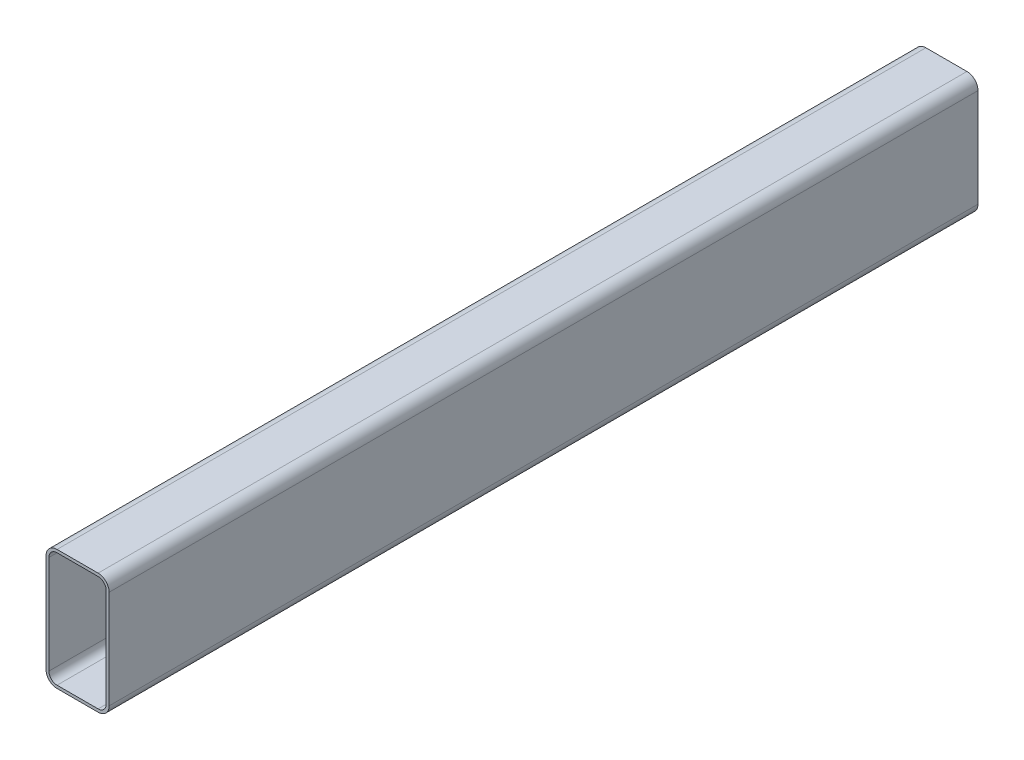
ISO-10303-21;
HEADER;
FILE_DESCRIPTION(('STEP AP214'),'2;1');
FILE_NAME('part.step','',(''),(''),'','','');
FILE_SCHEMA(('AUTOMOTIVE_DESIGN { 1 0 10303 214 1 1 1 1 }'));
ENDSEC;
DATA;
#1=APPLICATION_CONTEXT('core data for automotive mechanical design processes');
#2=APPLICATION_PROTOCOL_DEFINITION('international standard','automotive_design',2000,#1);
#3=PRODUCT_CONTEXT('',#1,'mechanical');
#4=PRODUCT('Part','Part','',(#3));
#5=PRODUCT_RELATED_PRODUCT_CATEGORY('part','',(#4));
#6=PRODUCT_DEFINITION_FORMATION('','',#4);
#7=PRODUCT_DEFINITION_CONTEXT('part definition',#1,'design');
#8=PRODUCT_DEFINITION('design','',#6,#7);
#9=PRODUCT_DEFINITION_SHAPE('','',#8);
#10=(LENGTH_UNIT() NAMED_UNIT(*) SI_UNIT(.MILLI.,.METRE.));
#11=(NAMED_UNIT(*) PLANE_ANGLE_UNIT() SI_UNIT($,.RADIAN.));
#12=(NAMED_UNIT(*) SI_UNIT($,.STERADIAN.) SOLID_ANGLE_UNIT());
#13=UNCERTAINTY_MEASURE_WITH_UNIT(LENGTH_MEASURE(1.E-05),#10,'distance_accuracy_value','');
#14=(GEOMETRIC_REPRESENTATION_CONTEXT(3) GLOBAL_UNCERTAINTY_ASSIGNED_CONTEXT((#13)) GLOBAL_UNIT_ASSIGNED_CONTEXT((#10,
#11,#12)) REPRESENTATION_CONTEXT('',''));
#15=CARTESIAN_POINT('',(0.,0.,0.));
#16=DIRECTION('',(0.,0.,1.));
#17=DIRECTION('',(1.,0.,0.));
#18=AXIS2_PLACEMENT_3D('',#15,#16,#17);
#19=CARTESIAN_POINT('',(9.001125,26.416,152.4));
#20=DIRECTION('',(0.,-1.,0.));
#21=DIRECTION('',(0.,0.,-1.));
#22=AXIS2_PLACEMENT_3D('',#19,#20,#21);
#23=PLANE('',#22);
#24=DIRECTION('',(0.,0.,-1.));
#25=VECTOR('',#24,1.);
#26=CARTESIAN_POINT('',(-9.001125,26.416,152.4));
#27=LINE('',#26,#25);
#28=CARTESIAN_POINT('',(-9.001125,26.416,152.4));
#29=VERTEX_POINT('',#28);
#30=CARTESIAN_POINT('',(-9.001125,26.416,-228.6));
#31=VERTEX_POINT('',#30);
#32=EDGE_CURVE('E167',#29,#31,#27,.T.);
#33=ORIENTED_EDGE('',*,*,#32,.F.);
#34=DIRECTION('',(1.,0.,0.));
#35=VECTOR('',#34,1.);
#36=CARTESIAN_POINT('',(9.001125,26.416,152.4));
#37=LINE('',#36,#35);
#38=CARTESIAN_POINT('',(9.001125,26.416,152.4));
#39=VERTEX_POINT('',#38);
#40=EDGE_CURVE('E244',#39,#29,#37,.F.);
#41=ORIENTED_EDGE('',*,*,#40,.F.);
#42=DIRECTION('',(0.,0.,-1.));
#43=VECTOR('',#42,1.);
#44=CARTESIAN_POINT('',(9.001125,26.416,152.4));
#45=LINE('',#44,#43);
#46=CARTESIAN_POINT('',(9.001125,26.416,-228.6));
#47=VERTEX_POINT('',#46);
#48=EDGE_CURVE('E261',#47,#39,#45,.F.);
#49=ORIENTED_EDGE('',*,*,#48,.F.);
#50=DIRECTION('',(1.,0.,0.));
#51=VECTOR('',#50,1.);
#52=CARTESIAN_POINT('',(-9.001125,26.416,-228.6));
#53=LINE('',#52,#51);
#54=EDGE_CURVE('E218',#31,#47,#53,.T.);
#55=ORIENTED_EDGE('',*,*,#54,.F.);
#56=EDGE_LOOP('',(#33,#41,#49,#55));
#57=FACE_BOUND('',#56,.T.);
#58=ADVANCED_FACE('F37',(#57),#23,.F.);
#59=CARTESIAN_POINT('',(-9.001125,-26.416,152.4));
#60=DIRECTION('',(0.,1.,0.));
#61=DIRECTION('',(0.,0.,1.));
#62=AXIS2_PLACEMENT_3D('',#59,#60,#61);
#63=PLANE('',#62);
#64=DIRECTION('',(0.,0.,-1.));
#65=VECTOR('',#64,1.);
#66=CARTESIAN_POINT('',(9.001125,-26.416,152.4));
#67=LINE('',#66,#65);
#68=CARTESIAN_POINT('',(9.001125,-26.416,152.4));
#69=VERTEX_POINT('',#68);
#70=CARTESIAN_POINT('',(9.001125,-26.416,-228.6));
#71=VERTEX_POINT('',#70);
#72=EDGE_CURVE('E220',#69,#71,#67,.T.);
#73=ORIENTED_EDGE('',*,*,#72,.F.);
#74=DIRECTION('',(1.,0.,0.));
#75=VECTOR('',#74,1.);
#76=CARTESIAN_POINT('',(9.001125,-26.416,152.4));
#77=LINE('',#76,#75);
#78=CARTESIAN_POINT('',(-9.001125,-26.416,152.4));
#79=VERTEX_POINT('',#78);
#80=EDGE_CURVE('E241',#79,#69,#77,.T.);
#81=ORIENTED_EDGE('',*,*,#80,.F.);
#82=DIRECTION('',(0.,0.,-1.));
#83=VECTOR('',#82,1.);
#84=CARTESIAN_POINT('',(-9.001125,-26.416,152.4));
#85=LINE('',#84,#83);
#86=CARTESIAN_POINT('',(-9.001125,-26.416,-228.6));
#87=VERTEX_POINT('',#86);
#88=EDGE_CURVE('E267',#87,#79,#85,.F.);
#89=ORIENTED_EDGE('',*,*,#88,.F.);
#90=DIRECTION('',(-1.,0.,0.));
#91=VECTOR('',#90,1.);
#92=CARTESIAN_POINT('',(9.001125,-26.416,-228.6));
#93=LINE('',#92,#91);
#94=EDGE_CURVE('E206',#71,#87,#93,.T.);
#95=ORIENTED_EDGE('',*,*,#94,.F.);
#96=EDGE_LOOP('',(#73,#81,#89,#95));
#97=FACE_BOUND('',#96,.T.);
#98=ADVANCED_FACE('F305',(#97),#63,.F.);
#99=CARTESIAN_POINT('',(9.001125,-21.574125,152.4));
#100=DIRECTION('',(0.,0.,-1.));
#101=DIRECTION('',(-1.,0.,0.));
#102=AXIS2_PLACEMENT_3D('',#99,#100,#101);
#103=CYLINDRICAL_SURFACE('',#102,4.841875);
#104=CARTESIAN_POINT('',(9.001125,-21.574125,152.4));
#105=DIRECTION('',(0.,0.,-1.));
#106=DIRECTION('',(-1.,0.,0.));
#107=AXIS2_PLACEMENT_3D('',#104,#105,#106);
#108=CIRCLE('',#107,4.841875);
#109=CARTESIAN_POINT('',(13.843,-21.574125,152.4));
#110=VERTEX_POINT('',#109);
#111=EDGE_CURVE('E240',#69,#110,#108,.F.);
#112=ORIENTED_EDGE('',*,*,#111,.F.);
#113=ORIENTED_EDGE('',*,*,#72,.T.);
#114=CARTESIAN_POINT('',(9.001125,-21.574125,-228.6));
#115=DIRECTION('',(0.,0.,-1.));
#116=DIRECTION('',(-1.,0.,0.));
#117=AXIS2_PLACEMENT_3D('',#114,#115,#116);
#118=CIRCLE('',#117,4.841875);
#119=CARTESIAN_POINT('',(13.843,-21.574125,-228.6));
#120=VERTEX_POINT('',#119);
#121=EDGE_CURVE('E203',#120,#71,#118,.T.);
#122=ORIENTED_EDGE('',*,*,#121,.F.);
#123=DIRECTION('',(0.,0.,1.));
#124=VECTOR('',#123,1.);
#125=CARTESIAN_POINT('',(13.843,-21.574125,152.4));
#126=LINE('',#125,#124);
#127=EDGE_CURVE('E263',#120,#110,#126,.T.);
#128=ORIENTED_EDGE('',*,*,#127,.T.);
#129=EDGE_LOOP('',(#112,#113,#122,#128));
#130=FACE_BOUND('',#129,.T.);
#131=ADVANCED_FACE('F301',(#130),#103,.T.);
#132=CARTESIAN_POINT('',(13.843,21.574125,152.4));
#133=DIRECTION('',(-1.,0.,0.));
#134=DIRECTION('',(0.,0.,1.));
#135=AXIS2_PLACEMENT_3D('',#132,#133,#134);
#136=PLANE('',#135);
#137=DIRECTION('',(0.,0.,-1.));
#138=VECTOR('',#137,1.);
#139=CARTESIAN_POINT('',(13.843,21.574125,152.4));
#140=LINE('',#139,#138);
#141=CARTESIAN_POINT('',(13.843,21.574125,152.4));
#142=VERTEX_POINT('',#141);
#143=CARTESIAN_POINT('',(13.843,21.574125,-228.6));
#144=VERTEX_POINT('',#143);
#145=EDGE_CURVE('E101',#142,#144,#140,.T.);
#146=ORIENTED_EDGE('',*,*,#145,.F.);
#147=DIRECTION('',(0.,1.,0.));
#148=VECTOR('',#147,1.);
#149=CARTESIAN_POINT('',(13.843,21.574125,152.4));
#150=LINE('',#149,#148);
#151=EDGE_CURVE('E238',#110,#142,#150,.T.);
#152=ORIENTED_EDGE('',*,*,#151,.F.);
#153=ORIENTED_EDGE('',*,*,#127,.F.);
#154=DIRECTION('',(0.,-1.,0.));
#155=VECTOR('',#154,1.);
#156=CARTESIAN_POINT('',(13.843,21.574125,-228.6));
#157=LINE('',#156,#155);
#158=EDGE_CURVE('E200',#144,#120,#157,.T.);
#159=ORIENTED_EDGE('',*,*,#158,.F.);
#160=EDGE_LOOP('',(#146,#152,#153,#159));
#161=FACE_BOUND('',#160,.T.);
#162=ADVANCED_FACE('F297',(#161),#136,.F.);
#163=CARTESIAN_POINT('',(9.001125,21.574125,152.4));
#164=DIRECTION('',(0.,0.,-1.));
#165=DIRECTION('',(-1.,0.,0.));
#166=AXIS2_PLACEMENT_3D('',#163,#164,#165);
#167=CYLINDRICAL_SURFACE('',#166,4.841875);
#168=CARTESIAN_POINT('',(9.001125,21.574125,152.4));
#169=DIRECTION('',(0.,0.,-1.));
#170=DIRECTION('',(-1.,0.,0.));
#171=AXIS2_PLACEMENT_3D('',#168,#169,#170);
#172=CIRCLE('',#171,4.841875);
#173=EDGE_CURVE('E40',#142,#39,#172,.F.);
#174=ORIENTED_EDGE('',*,*,#173,.F.);
#175=ORIENTED_EDGE('',*,*,#145,.T.);
#176=CARTESIAN_POINT('',(9.001125,21.574125,-228.6));
#177=DIRECTION('',(0.,0.,-1.));
#178=DIRECTION('',(-1.,0.,0.));
#179=AXIS2_PLACEMENT_3D('',#176,#177,#178);
#180=CIRCLE('',#179,4.841875);
#181=EDGE_CURVE('E197',#47,#144,#180,.T.);
#182=ORIENTED_EDGE('',*,*,#181,.F.);
#183=ORIENTED_EDGE('',*,*,#48,.T.);
#184=EDGE_LOOP('',(#174,#175,#182,#183));
#185=FACE_BOUND('',#184,.T.);
#186=ADVANCED_FACE('F295',(#185),#167,.T.);
#187=CARTESIAN_POINT('',(9.001125,25.146,152.4));
#188=DIRECTION('',(0.,-1.,0.));
#189=DIRECTION('',(0.,0.,-1.));
#190=AXIS2_PLACEMENT_3D('',#187,#188,#189);
#191=PLANE('',#190);
#192=DIRECTION('',(1.,0.,0.));
#193=VECTOR('',#192,1.);
#194=CARTESIAN_POINT('',(9.001125,25.146,152.4));
#195=LINE('',#194,#193);
#196=CARTESIAN_POINT('',(-9.001125,25.146,152.4));
#197=VERTEX_POINT('',#196);
#198=CARTESIAN_POINT('',(9.001125,25.146,152.4));
#199=VERTEX_POINT('',#198);
#200=EDGE_CURVE('E163',#197,#199,#195,.T.);
#201=ORIENTED_EDGE('',*,*,#200,.F.);
#202=DIRECTION('',(0.,0.,-1.));
#203=VECTOR('',#202,1.);
#204=CARTESIAN_POINT('',(-9.001125,25.146,152.4));
#205=LINE('',#204,#203);
#206=CARTESIAN_POINT('',(-9.001125,25.146,-228.6));
#207=VERTEX_POINT('',#206);
#208=EDGE_CURVE('E156',#197,#207,#205,.T.);
#209=ORIENTED_EDGE('',*,*,#208,.T.);
#210=DIRECTION('',(1.,0.,0.));
#211=VECTOR('',#210,1.);
#212=CARTESIAN_POINT('',(-9.001125,25.146,-228.6));
#213=LINE('',#212,#211);
#214=CARTESIAN_POINT('',(9.001125,25.146,-228.6));
#215=VERTEX_POINT('',#214);
#216=EDGE_CURVE('E161',#207,#215,#213,.T.);
#217=ORIENTED_EDGE('',*,*,#216,.T.);
#218=DIRECTION('',(0.,0.,-1.));
#219=VECTOR('',#218,1.);
#220=CARTESIAN_POINT('',(9.001125,25.146,152.4));
#221=LINE('',#220,#219);
#222=EDGE_CURVE('E258',#215,#199,#221,.F.);
#223=ORIENTED_EDGE('',*,*,#222,.T.);
#224=EDGE_LOOP('',(#201,#209,#217,#223));
#225=FACE_BOUND('',#224,.T.);
#226=ADVANCED_FACE('F158',(#225),#191,.T.);
#227=CARTESIAN_POINT('',(9.001125,21.574125,152.4));
#228=DIRECTION('',(0.,0.,-1.));
#229=DIRECTION('',(-1.,0.,0.));
#230=AXIS2_PLACEMENT_3D('',#227,#228,#229);
#231=CYLINDRICAL_SURFACE('',#230,3.571875);
#232=DIRECTION('',(0.,0.,1.));
#233=VECTOR('',#232,1.);
#234=CARTESIAN_POINT('',(12.573,21.574125,152.4));
#235=LINE('',#234,#233);
#236=CARTESIAN_POINT('',(12.573,21.574125,152.4));
#237=VERTEX_POINT('',#236);
#238=CARTESIAN_POINT('',(12.573,21.574125,-228.6));
#239=VERTEX_POINT('',#238);
#240=EDGE_CURVE('E256',#237,#239,#235,.F.);
#241=ORIENTED_EDGE('',*,*,#240,.F.);
#242=CARTESIAN_POINT('',(9.001125,21.574125,152.4));
#243=DIRECTION('',(0.,0.,-1.));
#244=DIRECTION('',(-1.,0.,0.));
#245=AXIS2_PLACEMENT_3D('',#242,#243,#244);
#246=CIRCLE('',#245,3.571875);
#247=EDGE_CURVE('E233',#199,#237,#246,.T.);
#248=ORIENTED_EDGE('',*,*,#247,.F.);
#249=ORIENTED_EDGE('',*,*,#222,.F.);
#250=CARTESIAN_POINT('',(9.001125,21.574125,-228.6));
#251=DIRECTION('',(0.,0.,-1.));
#252=DIRECTION('',(-1.,0.,0.));
#253=AXIS2_PLACEMENT_3D('',#250,#251,#252);
#254=CIRCLE('',#253,3.571875);
#255=EDGE_CURVE('E180',#215,#239,#254,.T.);
#256=ORIENTED_EDGE('',*,*,#255,.T.);
#257=EDGE_LOOP('',(#241,#248,#249,#256));
#258=FACE_BOUND('',#257,.T.);
#259=ADVANCED_FACE('F341',(#258),#231,.F.);
#260=CARTESIAN_POINT('',(12.573,21.574125,152.4));
#261=DIRECTION('',(-1.,0.,0.));
#262=DIRECTION('',(0.,0.,1.));
#263=AXIS2_PLACEMENT_3D('',#260,#261,#262);
#264=PLANE('',#263);
#265=DIRECTION('',(0.,1.,0.));
#266=VECTOR('',#265,1.);
#267=CARTESIAN_POINT('',(12.573,21.574125,152.4));
#268=LINE('',#267,#266);
#269=CARTESIAN_POINT('',(12.573,-21.574125,152.4));
#270=VERTEX_POINT('',#269);
#271=EDGE_CURVE('E231',#237,#270,#268,.F.);
#272=ORIENTED_EDGE('',*,*,#271,.F.);
#273=ORIENTED_EDGE('',*,*,#240,.T.);
#274=DIRECTION('',(0.,-1.,0.));
#275=VECTOR('',#274,1.);
#276=CARTESIAN_POINT('',(12.573,21.574125,-228.6));
#277=LINE('',#276,#275);
#278=CARTESIAN_POINT('',(12.573,-21.574125,-228.6));
#279=VERTEX_POINT('',#278);
#280=EDGE_CURVE('E182',#239,#279,#277,.T.);
#281=ORIENTED_EDGE('',*,*,#280,.T.);
#282=DIRECTION('',(0.,0.,-1.));
#283=VECTOR('',#282,1.);
#284=CARTESIAN_POINT('',(12.573,-21.574125,152.4));
#285=LINE('',#284,#283);
#286=EDGE_CURVE('E253',#279,#270,#285,.F.);
#287=ORIENTED_EDGE('',*,*,#286,.T.);
#288=EDGE_LOOP('',(#272,#273,#281,#287));
#289=FACE_BOUND('',#288,.T.);
#290=ADVANCED_FACE('F337',(#289),#264,.T.);
#291=CARTESIAN_POINT('',(9.001125,-21.574125,152.4));
#292=DIRECTION('',(0.,0.,-1.));
#293=DIRECTION('',(-1.,0.,0.));
#294=AXIS2_PLACEMENT_3D('',#291,#292,#293);
#295=CYLINDRICAL_SURFACE('',#294,3.571875);
#296=DIRECTION('',(0.,0.,1.));
#297=VECTOR('',#296,1.);
#298=CARTESIAN_POINT('',(9.001125,-25.146,152.4));
#299=LINE('',#298,#297);
#300=CARTESIAN_POINT('',(9.001125,-25.146,152.4));
#301=VERTEX_POINT('',#300);
#302=CARTESIAN_POINT('',(9.001125,-25.146,-228.6));
#303=VERTEX_POINT('',#302);
#304=EDGE_CURVE('E251',#301,#303,#299,.F.);
#305=ORIENTED_EDGE('',*,*,#304,.F.);
#306=CARTESIAN_POINT('',(9.001125,-21.574125,152.4));
#307=DIRECTION('',(0.,0.,-1.));
#308=DIRECTION('',(-1.,0.,0.));
#309=AXIS2_PLACEMENT_3D('',#306,#307,#308);
#310=CIRCLE('',#309,3.571875);
#311=EDGE_CURVE('E230',#270,#301,#310,.T.);
#312=ORIENTED_EDGE('',*,*,#311,.F.);
#313=ORIENTED_EDGE('',*,*,#286,.F.);
#314=CARTESIAN_POINT('',(9.001125,-21.574125,-228.6));
#315=DIRECTION('',(0.,0.,-1.));
#316=DIRECTION('',(-1.,0.,0.));
#317=AXIS2_PLACEMENT_3D('',#314,#315,#316);
#318=CIRCLE('',#317,3.571875);
#319=EDGE_CURVE('E187',#279,#303,#318,.T.);
#320=ORIENTED_EDGE('',*,*,#319,.T.);
#321=EDGE_LOOP('',(#305,#312,#313,#320));
#322=FACE_BOUND('',#321,.T.);
#323=ADVANCED_FACE('F333',(#322),#295,.F.);
#324=CARTESIAN_POINT('',(-9.001125,-25.146,152.4));
#325=DIRECTION('',(0.,1.,0.));
#326=DIRECTION('',(0.,0.,1.));
#327=AXIS2_PLACEMENT_3D('',#324,#325,#326);
#328=PLANE('',#327);
#329=DIRECTION('',(1.,0.,0.));
#330=VECTOR('',#329,1.);
#331=CARTESIAN_POINT('',(9.001125,-25.146,152.4));
#332=LINE('',#331,#330);
#333=CARTESIAN_POINT('',(-9.001125,-25.146,152.4));
#334=VERTEX_POINT('',#333);
#335=EDGE_CURVE('E227',#301,#334,#332,.F.);
#336=ORIENTED_EDGE('',*,*,#335,.F.);
#337=ORIENTED_EDGE('',*,*,#304,.T.);
#338=DIRECTION('',(-1.,0.,0.));
#339=VECTOR('',#338,1.);
#340=CARTESIAN_POINT('',(9.001125,-25.146,-228.6));
#341=LINE('',#340,#339);
#342=CARTESIAN_POINT('',(-9.001125,-25.146,-228.6));
#343=VERTEX_POINT('',#342);
#344=EDGE_CURVE('E190',#303,#343,#341,.T.);
#345=ORIENTED_EDGE('',*,*,#344,.T.);
#346=DIRECTION('',(0.,0.,-1.));
#347=VECTOR('',#346,1.);
#348=CARTESIAN_POINT('',(-9.001125,-25.146,152.4));
#349=LINE('',#348,#347);
#350=EDGE_CURVE('E248',#343,#334,#349,.F.);
#351=ORIENTED_EDGE('',*,*,#350,.T.);
#352=EDGE_LOOP('',(#336,#337,#345,#351));
#353=FACE_BOUND('',#352,.T.);
#354=ADVANCED_FACE('F329',(#353),#328,.T.);
#355=CARTESIAN_POINT('',(-9.001125,-21.574125,152.4));
#356=DIRECTION('',(0.,0.,-1.));
#357=DIRECTION('',(-1.,0.,0.));
#358=AXIS2_PLACEMENT_3D('',#355,#356,#357);
#359=CYLINDRICAL_SURFACE('',#358,3.571875);
#360=DIRECTION('',(0.,0.,-1.));
#361=VECTOR('',#360,1.);
#362=CARTESIAN_POINT('',(-12.573,-21.574125,152.4));
#363=LINE('',#362,#361);
#364=CARTESIAN_POINT('',(-12.573,-21.574125,152.4));
#365=VERTEX_POINT('',#364);
#366=CARTESIAN_POINT('',(-12.573,-21.574125,-228.6));
#367=VERTEX_POINT('',#366);
#368=EDGE_CURVE('E109',#365,#367,#363,.T.);
#369=ORIENTED_EDGE('',*,*,#368,.F.);
#370=CARTESIAN_POINT('',(-9.001125,-21.574125,152.4));
#371=DIRECTION('',(0.,0.,-1.));
#372=DIRECTION('',(-1.,0.,0.));
#373=AXIS2_PLACEMENT_3D('',#370,#371,#372);
#374=CIRCLE('',#373,3.571875);
#375=EDGE_CURVE('E229',#334,#365,#374,.T.);
#376=ORIENTED_EDGE('',*,*,#375,.F.);
#377=ORIENTED_EDGE('',*,*,#350,.F.);
#378=CARTESIAN_POINT('',(-9.001125,-21.574125,-228.6));
#379=DIRECTION('',(0.,0.,-1.));
#380=DIRECTION('',(-1.,0.,0.));
#381=AXIS2_PLACEMENT_3D('',#378,#379,#380);
#382=CIRCLE('',#381,3.571875);
#383=EDGE_CURVE('E193',#343,#367,#382,.T.);
#384=ORIENTED_EDGE('',*,*,#383,.T.);
#385=EDGE_LOOP('',(#369,#376,#377,#384));
#386=FACE_BOUND('',#385,.T.);
#387=ADVANCED_FACE('F326',(#386),#359,.F.);
#388=CARTESIAN_POINT('',(-12.573,-21.574125,152.4));
#389=DIRECTION('',(1.,0.,0.));
#390=DIRECTION('',(0.,0.,-1.));
#391=AXIS2_PLACEMENT_3D('',#388,#389,#390);
#392=PLANE('',#391);
#393=DIRECTION('',(0.,1.,0.));
#394=VECTOR('',#393,1.);
#395=CARTESIAN_POINT('',(-12.573,21.574125,152.4));
#396=LINE('',#395,#394);
#397=CARTESIAN_POINT('',(-12.573,21.574125,152.4));
#398=VERTEX_POINT('',#397);
#399=EDGE_CURVE('E236',#365,#398,#396,.T.);
#400=ORIENTED_EDGE('',*,*,#399,.F.);
#401=ORIENTED_EDGE('',*,*,#368,.T.);
#402=DIRECTION('',(0.,1.,0.));
#403=VECTOR('',#402,1.);
#404=CARTESIAN_POINT('',(-12.573,-21.574125,-228.6));
#405=LINE('',#404,#403);
#406=CARTESIAN_POINT('',(-12.573,21.574125,-228.6));
#407=VERTEX_POINT('',#406);
#408=EDGE_CURVE('E195',#367,#407,#405,.T.);
#409=ORIENTED_EDGE('',*,*,#408,.T.);
#410=DIRECTION('',(0.,0.,-1.));
#411=VECTOR('',#410,1.);
#412=CARTESIAN_POINT('',(-12.573,21.574125,152.4));
#413=LINE('',#412,#411);
#414=EDGE_CURVE('E168',#407,#398,#413,.F.);
#415=ORIENTED_EDGE('',*,*,#414,.T.);
#416=EDGE_LOOP('',(#400,#401,#409,#415));
#417=FACE_BOUND('',#416,.T.);
#418=ADVANCED_FACE('F323',(#417),#392,.T.);
#419=CARTESIAN_POINT('',(-9.001125,21.574125,152.4));
#420=DIRECTION('',(0.,0.,-1.));
#421=DIRECTION('',(-1.,0.,0.));
#422=AXIS2_PLACEMENT_3D('',#419,#420,#421);
#423=CYLINDRICAL_SURFACE('',#422,3.571875);
#424=ORIENTED_EDGE('',*,*,#208,.F.);
#425=CARTESIAN_POINT('',(-9.001125,21.574125,152.4));
#426=DIRECTION('',(0.,0.,-1.));
#427=DIRECTION('',(-1.,0.,0.));
#428=AXIS2_PLACEMENT_3D('',#425,#426,#427);
#429=CIRCLE('',#428,3.571875);
#430=EDGE_CURVE('E235',#398,#197,#429,.T.);
#431=ORIENTED_EDGE('',*,*,#430,.F.);
#432=ORIENTED_EDGE('',*,*,#414,.F.);
#433=CARTESIAN_POINT('',(-9.001125,21.574125,-228.6));
#434=DIRECTION('',(0.,0.,-1.));
#435=DIRECTION('',(-1.,0.,0.));
#436=AXIS2_PLACEMENT_3D('',#433,#434,#435);
#437=CIRCLE('',#436,3.571875);
#438=EDGE_CURVE('E171',#407,#207,#437,.T.);
#439=ORIENTED_EDGE('',*,*,#438,.T.);
#440=EDGE_LOOP('',(#424,#431,#432,#439));
#441=FACE_BOUND('',#440,.T.);
#442=ADVANCED_FACE('F172',(#441),#423,.F.);
#443=CARTESIAN_POINT('',(-9.001125,21.574125,152.4));
#444=DIRECTION('',(0.,0.,-1.));
#445=DIRECTION('',(-1.,0.,0.));
#446=AXIS2_PLACEMENT_3D('',#443,#444,#445);
#447=CYLINDRICAL_SURFACE('',#446,4.841875);
#448=CARTESIAN_POINT('',(-9.001125,21.574125,152.4));
#449=DIRECTION('',(0.,0.,-1.));
#450=DIRECTION('',(-1.,0.,0.));
#451=AXIS2_PLACEMENT_3D('',#448,#449,#450);
#452=CIRCLE('',#451,4.841875);
#453=CARTESIAN_POINT('',(-13.843,21.574125,152.4));
#454=VERTEX_POINT('',#453);
#455=EDGE_CURVE('E243',#29,#454,#452,.F.);
#456=ORIENTED_EDGE('',*,*,#455,.F.);
#457=ORIENTED_EDGE('',*,*,#32,.T.);
#458=CARTESIAN_POINT('',(-9.001125,21.574125,-228.6));
#459=DIRECTION('',(0.,0.,-1.));
#460=DIRECTION('',(-1.,0.,0.));
#461=AXIS2_PLACEMENT_3D('',#458,#459,#460);
#462=CIRCLE('',#461,4.841875);
#463=CARTESIAN_POINT('',(-13.843,21.574125,-228.6));
#464=VERTEX_POINT('',#463);
#465=EDGE_CURVE('E215',#464,#31,#462,.T.);
#466=ORIENTED_EDGE('',*,*,#465,.F.);
#467=DIRECTION('',(0.,0.,-1.));
#468=VECTOR('',#467,1.);
#469=CARTESIAN_POINT('',(-13.843,21.574125,152.4));
#470=LINE('',#469,#468);
#471=EDGE_CURVE('E222',#464,#454,#470,.F.);
#472=ORIENTED_EDGE('',*,*,#471,.T.);
#473=EDGE_LOOP('',(#456,#457,#466,#472));
#474=FACE_BOUND('',#473,.T.);
#475=ADVANCED_FACE('F288',(#474),#447,.T.);
#476=CARTESIAN_POINT('',(9.001125,21.574125,152.4));
#477=DIRECTION('',(0.,0.,1.));
#478=DIRECTION('',(1.,0.,0.));
#479=AXIS2_PLACEMENT_3D('',#476,#477,#478);
#480=PLANE('',#479);
#481=ORIENTED_EDGE('',*,*,#335,.T.);
#482=ORIENTED_EDGE('',*,*,#375,.T.);
#483=ORIENTED_EDGE('',*,*,#399,.T.);
#484=ORIENTED_EDGE('',*,*,#430,.T.);
#485=ORIENTED_EDGE('',*,*,#200,.T.);
#486=ORIENTED_EDGE('',*,*,#247,.T.);
#487=ORIENTED_EDGE('',*,*,#271,.T.);
#488=ORIENTED_EDGE('',*,*,#311,.T.);
#489=EDGE_LOOP('',(#481,#482,#483,#484,#485,#486,#487,#488));
#490=FACE_BOUND('',#489,.T.);
#491=ORIENTED_EDGE('',*,*,#111,.T.);
#492=ORIENTED_EDGE('',*,*,#151,.T.);
#493=ORIENTED_EDGE('',*,*,#173,.T.);
#494=ORIENTED_EDGE('',*,*,#40,.T.);
#495=ORIENTED_EDGE('',*,*,#455,.T.);
#496=DIRECTION('',(0.,1.,0.));
#497=VECTOR('',#496,1.);
#498=CARTESIAN_POINT('',(-13.843,-21.574125,152.4));
#499=LINE('',#498,#497);
#500=CARTESIAN_POINT('',(-13.843,-21.574125,152.4));
#501=VERTEX_POINT('',#500);
#502=EDGE_CURVE('E46',#454,#501,#499,.F.);
#503=ORIENTED_EDGE('',*,*,#502,.T.);
#504=CARTESIAN_POINT('',(-9.001125,-21.574125,152.4));
#505=DIRECTION('',(0.,0.,-1.));
#506=DIRECTION('',(-1.,0.,0.));
#507=AXIS2_PLACEMENT_3D('',#504,#505,#506);
#508=CIRCLE('',#507,4.841875);
#509=EDGE_CURVE('E54',#79,#501,#508,.T.);
#510=ORIENTED_EDGE('',*,*,#509,.F.);
#511=ORIENTED_EDGE('',*,*,#80,.T.);
#512=EDGE_LOOP('',(#491,#492,#493,#494,#495,#503,#510,#511));
#513=FACE_BOUND('',#512,.T.);
#514=ADVANCED_FACE('F279',(#490,#513),#480,.T.);
#515=CARTESIAN_POINT('',(-9.001125,-21.574125,152.4));
#516=DIRECTION('',(0.,0.,-1.));
#517=DIRECTION('',(-1.,0.,0.));
#518=AXIS2_PLACEMENT_3D('',#515,#516,#517);
#519=CYLINDRICAL_SURFACE('',#518,4.841875);
#520=ORIENTED_EDGE('',*,*,#509,.T.);
#521=DIRECTION('',(0.,0.,-1.));
#522=VECTOR('',#521,1.);
#523=CARTESIAN_POINT('',(-13.843,-21.574125,152.4));
#524=LINE('',#523,#522);
#525=CARTESIAN_POINT('',(-13.843,-21.574125,-228.6));
#526=VERTEX_POINT('',#525);
#527=EDGE_CURVE('E11',#501,#526,#524,.T.);
#528=ORIENTED_EDGE('',*,*,#527,.T.);
#529=CARTESIAN_POINT('',(-9.001125,-21.574125,-228.6));
#530=DIRECTION('',(0.,0.,-1.));
#531=DIRECTION('',(-1.,0.,0.));
#532=AXIS2_PLACEMENT_3D('',#529,#530,#531);
#533=CIRCLE('',#532,4.841875);
#534=EDGE_CURVE('E209',#87,#526,#533,.T.);
#535=ORIENTED_EDGE('',*,*,#534,.F.);
#536=ORIENTED_EDGE('',*,*,#88,.T.);
#537=EDGE_LOOP('',(#520,#528,#535,#536));
#538=FACE_BOUND('',#537,.T.);
#539=ADVANCED_FACE('F307',(#538),#519,.T.);
#540=CARTESIAN_POINT('',(-13.843,-21.574125,152.4));
#541=DIRECTION('',(1.,0.,0.));
#542=DIRECTION('',(0.,0.,-1.));
#543=AXIS2_PLACEMENT_3D('',#540,#541,#542);
#544=PLANE('',#543);
#545=ORIENTED_EDGE('',*,*,#527,.F.);
#546=ORIENTED_EDGE('',*,*,#502,.F.);
#547=ORIENTED_EDGE('',*,*,#471,.F.);
#548=DIRECTION('',(0.,1.,0.));
#549=VECTOR('',#548,1.);
#550=CARTESIAN_POINT('',(-13.843,-21.574125,-228.6));
#551=LINE('',#550,#549);
#552=EDGE_CURVE('E212',#526,#464,#551,.T.);
#553=ORIENTED_EDGE('',*,*,#552,.F.);
#554=EDGE_LOOP('',(#545,#546,#547,#553));
#555=FACE_BOUND('',#554,.T.);
#556=ADVANCED_FACE('F285',(#555),#544,.F.);
#557=CARTESIAN_POINT('',(9.001125,21.574125,-228.6));
#558=DIRECTION('',(0.,0.,-1.));
#559=DIRECTION('',(-1.,0.,0.));
#560=AXIS2_PLACEMENT_3D('',#557,#558,#559);
#561=PLANE('',#560);
#562=ORIENTED_EDGE('',*,*,#181,.T.);
#563=ORIENTED_EDGE('',*,*,#158,.T.);
#564=ORIENTED_EDGE('',*,*,#121,.T.);
#565=ORIENTED_EDGE('',*,*,#94,.T.);
#566=ORIENTED_EDGE('',*,*,#534,.T.);
#567=ORIENTED_EDGE('',*,*,#552,.T.);
#568=ORIENTED_EDGE('',*,*,#465,.T.);
#569=ORIENTED_EDGE('',*,*,#54,.T.);
#570=EDGE_LOOP('',(#562,#563,#564,#565,#566,#567,#568,#569));
#571=FACE_BOUND('',#570,.T.);
#572=ORIENTED_EDGE('',*,*,#216,.F.);
#573=ORIENTED_EDGE('',*,*,#438,.F.);
#574=ORIENTED_EDGE('',*,*,#408,.F.);
#575=ORIENTED_EDGE('',*,*,#383,.F.);
#576=ORIENTED_EDGE('',*,*,#344,.F.);
#577=ORIENTED_EDGE('',*,*,#319,.F.);
#578=ORIENTED_EDGE('',*,*,#280,.F.);
#579=ORIENTED_EDGE('',*,*,#255,.F.);
#580=EDGE_LOOP('',(#572,#573,#574,#575,#576,#577,#578,#579));
#581=FACE_BOUND('',#580,.T.);
#582=ADVANCED_FACE('F177',(#571,#581),#561,.T.);
#583=CLOSED_SHELL('',(#58,#98,#131,#162,#186,#226,#259,#290,#323,#354,#387,#418,#442,#475,#514,
#539,#556,#582));
#584=MANIFOLD_SOLID_BREP('B2',#583);
#585=ADVANCED_BREP_SHAPE_REPRESENTATION('',(#18,#584),#14);
#586=SHAPE_DEFINITION_REPRESENTATION(#9,#585);
ENDSEC;
END-ISO-10303-21;
